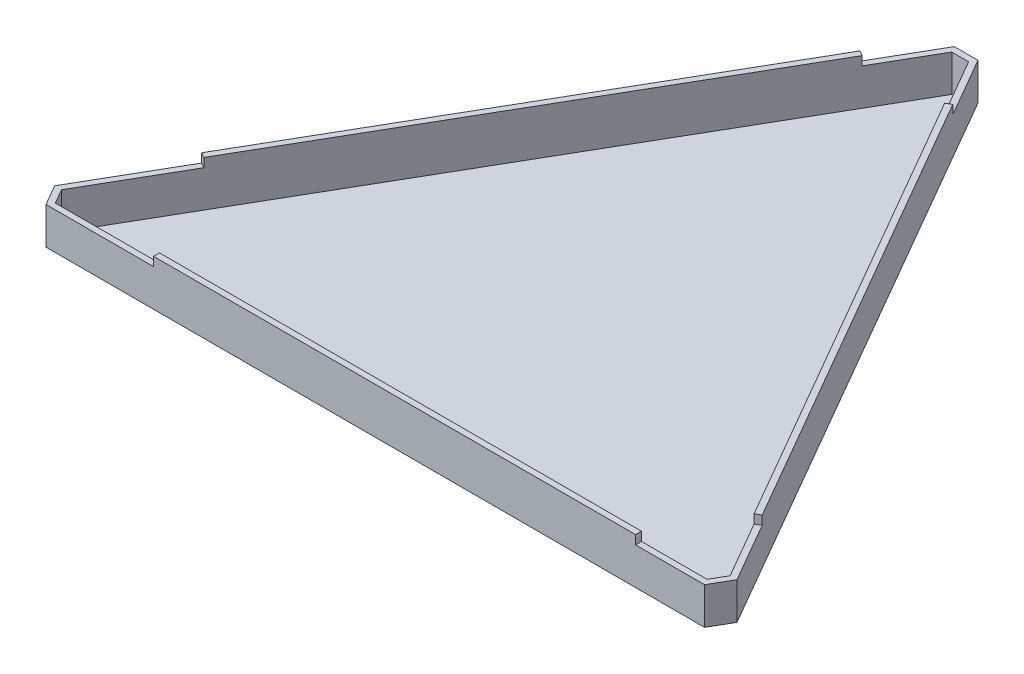
ISO-10303-21;
HEADER;
FILE_DESCRIPTION(('STEP AP214'),'2;1');
FILE_NAME('part.step','',(''),(''),'','','');
FILE_SCHEMA(('AUTOMOTIVE_DESIGN { 1 0 10303 214 1 1 1 1 }'));
ENDSEC;
DATA;
#1=APPLICATION_CONTEXT('core data for automotive mechanical design processes');
#2=APPLICATION_PROTOCOL_DEFINITION('international standard','automotive_design',2000,#1);
#3=PRODUCT_CONTEXT('',#1,'mechanical');
#4=PRODUCT('Part','Part','',(#3));
#5=PRODUCT_RELATED_PRODUCT_CATEGORY('part','',(#4));
#6=PRODUCT_DEFINITION_FORMATION('','',#4);
#7=PRODUCT_DEFINITION_CONTEXT('part definition',#1,'design');
#8=PRODUCT_DEFINITION('design','',#6,#7);
#9=PRODUCT_DEFINITION_SHAPE('','',#8);
#10=(LENGTH_UNIT() NAMED_UNIT(*) SI_UNIT(.MILLI.,.METRE.));
#11=(NAMED_UNIT(*) PLANE_ANGLE_UNIT() SI_UNIT($,.RADIAN.));
#12=(NAMED_UNIT(*) SI_UNIT($,.STERADIAN.) SOLID_ANGLE_UNIT());
#13=UNCERTAINTY_MEASURE_WITH_UNIT(LENGTH_MEASURE(1.E-05),#10,'distance_accuracy_value','');
#14=(GEOMETRIC_REPRESENTATION_CONTEXT(3) GLOBAL_UNCERTAINTY_ASSIGNED_CONTEXT((#13)) GLOBAL_UNIT_ASSIGNED_CONTEXT((#10,
#11,#12)) REPRESENTATION_CONTEXT('',''));
#15=CARTESIAN_POINT('',(0.,0.,0.));
#16=DIRECTION('',(0.,0.,1.));
#17=DIRECTION('',(1.,0.,0.));
#18=AXIS2_PLACEMENT_3D('',#15,#16,#17);
#19=CARTESIAN_POINT('',(0.,0.08,0.));
#20=DIRECTION('',(0.,1.,0.));
#21=DIRECTION('',(0.,0.,1.));
#22=AXIS2_PLACEMENT_3D('',#19,#20,#21);
#23=PLANE('',#22);
#24=DIRECTION('',(-0.500000000000004,0.,-0.866025403784437));
#25=VECTOR('',#24,1.);
#26=CARTESIAN_POINT('',(84.5179491924322,0.08,-48.7964607176064));
#27=LINE('',#26,#25);
#28=CARTESIAN_POINT('',(112.690598923244,0.08,0.));
#29=VERTEX_POINT('',#28);
#30=CARTESIAN_POINT('',(2.84529946162276,0.08,-190.257639640145));
#31=VERTEX_POINT('',#30);
#32=EDGE_CURVE('E59',#29,#31,#27,.T.);
#33=ORIENTED_EDGE('',*,*,#32,.T.);
#34=DIRECTION('',(-1.,0.,3.02401506656851E-13));
#35=VECTOR('',#34,1.);
#36=CARTESIAN_POINT('',(-5.7534196880156E-11,0.08,-190.257639640144));
#37=LINE('',#36,#35);
#38=CARTESIAN_POINT('',(-2.84529946162175,0.08,-190.257639640144));
#39=VERTEX_POINT('',#38);
#40=EDGE_CURVE('E303',#31,#39,#37,.T.);
#41=ORIENTED_EDGE('',*,*,#40,.T.);
#42=DIRECTION('',(-0.500000000000004,0.,0.866025403784436));
#43=VECTOR('',#42,1.);
#44=CARTESIAN_POINT('',(-84.5179491924306,0.08,-48.7964607176055));
#45=LINE('',#44,#43);
#46=CARTESIAN_POINT('',(-112.690598923241,0.08,0.));
#47=VERTEX_POINT('',#46);
#48=EDGE_CURVE('E52',#39,#47,#45,.T.);
#49=ORIENTED_EDGE('',*,*,#48,.T.);
#50=DIRECTION('',(-0.499999999999998,0.,-0.86602540378444));
#51=VECTOR('',#50,1.);
#52=CARTESIAN_POINT('',(-84.5179491924314,0.08,48.7964607176051));
#53=LINE('',#52,#51);
#54=CARTESIAN_POINT('',(-109.845299461621,0.0800000000000002,4.92820323027554));
#55=VERTEX_POINT('',#54);
#56=EDGE_CURVE('E334',#55,#47,#53,.T.);
#57=ORIENTED_EDGE('',*,*,#56,.F.);
#58=DIRECTION('',(1.,0.,0.));
#59=VECTOR('',#58,1.);
#60=CARTESIAN_POINT('',(0.,0.08,4.92820323027603));
#61=LINE('',#60,#59);
#62=CARTESIAN_POINT('',(109.845299461621,0.08,4.92820323027552));
#63=VERTEX_POINT('',#62);
#64=EDGE_CURVE('E362',#55,#63,#61,.T.);
#65=ORIENTED_EDGE('',*,*,#64,.T.);
#66=DIRECTION('',(0.500000000000268,0.,-0.866025403784284));
#67=VECTOR('',#66,1.);
#68=CARTESIAN_POINT('',(84.5179491924025,0.08,48.7964607176236));
#69=LINE('',#68,#67);
#70=EDGE_CURVE('E364',#63,#29,#69,.T.);
#71=ORIENTED_EDGE('',*,*,#70,.T.);
#72=EDGE_LOOP('',(#33,#41,#49,#57,#65,#71));
#73=FACE_BOUND('',#72,.T.);
#74=ADVANCED_FACE('F37',(#73),#23,.T.);
#75=CARTESIAN_POINT('',(86.25,0.08,-49.7964607176052));
#76=DIRECTION('',(-0.866025403784439,0.,0.5));
#77=DIRECTION('',(0.5,0.,0.866025403784439));
#78=AXIS2_PLACEMENT_3D('',#75,#76,#77);
#79=PLANE('',#78);
#80=DIRECTION('',(-0.5,0.,-0.866025403784439));
#81=VECTOR('',#80,1.);
#82=CARTESIAN_POINT('',(86.25,0.,-49.7964607176052));
#83=LINE('',#82,#81);
#84=CARTESIAN_POINT('',(115.,0.,0.));
#85=VERTEX_POINT('',#84);
#86=CARTESIAN_POINT('',(4.,0.,-192.257639640145));
#87=VERTEX_POINT('',#86);
#88=EDGE_CURVE('E367',#85,#87,#83,.T.);
#89=ORIENTED_EDGE('',*,*,#88,.T.);
#90=DIRECTION('',(0.,-1.,0.));
#91=VECTOR('',#90,1.);
#92=CARTESIAN_POINT('',(4.,0.08,-192.257639640145));
#93=LINE('',#92,#91);
#94=CARTESIAN_POINT('',(4.,12.46,-192.257639640145));
#95=VERTEX_POINT('',#94);
#96=EDGE_CURVE('E11',#95,#87,#93,.T.);
#97=ORIENTED_EDGE('',*,*,#96,.F.);
#98=DIRECTION('',(0.500000000000004,0.,0.866025403784436));
#99=VECTOR('',#98,1.);
#100=CARTESIAN_POINT('',(86.2500000000004,12.46,-49.7964607176059));
#101=LINE('',#100,#99);
#102=CARTESIAN_POINT('',(15.6250000000031,12.46,-172.122549002152));
#103=VERTEX_POINT('',#102);
#104=EDGE_CURVE('E276',#95,#103,#101,.T.);
#105=ORIENTED_EDGE('',*,*,#104,.T.);
#106=DIRECTION('',(0.,-1.,0.));
#107=VECTOR('',#106,1.);
#108=CARTESIAN_POINT('',(15.6250000000031,15.46,-172.122549002152));
#109=LINE('',#108,#107);
#110=CARTESIAN_POINT('',(15.6250000000031,15.46,-172.122549002152));
#111=VERTEX_POINT('',#110);
#112=EDGE_CURVE('E231',#111,#103,#109,.T.);
#113=ORIENTED_EDGE('',*,*,#112,.F.);
#114=DIRECTION('',(0.5,0.,0.866025403784439));
#115=VECTOR('',#114,1.);
#116=CARTESIAN_POINT('',(86.25,15.46,-49.7964607176052));
#117=LINE('',#116,#115);
#118=CARTESIAN_POINT('',(103.375000000003,15.46,-20.1350906379831));
#119=VERTEX_POINT('',#118);
#120=EDGE_CURVE('E224',#111,#119,#117,.T.);
#121=ORIENTED_EDGE('',*,*,#120,.T.);
#122=DIRECTION('',(0.,-1.,0.));
#123=VECTOR('',#122,1.);
#124=CARTESIAN_POINT('',(103.375000000003,15.46,-20.1350906379831));
#125=LINE('',#124,#123);
#126=CARTESIAN_POINT('',(103.375000000003,12.46,-20.1350906379831));
#127=VERTEX_POINT('',#126);
#128=EDGE_CURVE('E210',#119,#127,#125,.T.);
#129=ORIENTED_EDGE('',*,*,#128,.T.);
#130=DIRECTION('',(-0.5,0.,-0.866025403784439));
#131=VECTOR('',#130,1.);
#132=CARTESIAN_POINT('',(86.25,12.46,-49.7964607176052));
#133=LINE('',#132,#131);
#134=CARTESIAN_POINT('',(115.,12.46,0.));
#135=VERTEX_POINT('',#134);
#136=EDGE_CURVE('E354',#135,#127,#133,.T.);
#137=ORIENTED_EDGE('',*,*,#136,.F.);
#138=DIRECTION('',(0.,-1.,0.));
#139=VECTOR('',#138,1.);
#140=CARTESIAN_POINT('',(115.,0.08,0.));
#141=LINE('',#140,#139);
#142=EDGE_CURVE('E380',#135,#85,#141,.T.);
#143=ORIENTED_EDGE('',*,*,#142,.T.);
#144=EDGE_LOOP('',(#89,#97,#105,#113,#121,#129,#137,#143));
#145=FACE_BOUND('',#144,.T.);
#146=ADVANCED_FACE('F39',(#145),#79,.F.);
#147=CARTESIAN_POINT('',(0.,0.08,-192.257639640145));
#148=DIRECTION('',(0.,0.,1.));
#149=DIRECTION('',(1.,0.,0.));
#150=AXIS2_PLACEMENT_3D('',#147,#148,#149);
#151=PLANE('',#150);
#152=DIRECTION('',(-1.,0.,0.));
#153=VECTOR('',#152,1.);
#154=CARTESIAN_POINT('',(0.,0.,-192.257639640145));
#155=LINE('',#154,#153);
#156=CARTESIAN_POINT('',(-4.,0.,-192.257639640145));
#157=VERTEX_POINT('',#156);
#158=EDGE_CURVE('E369',#87,#157,#155,.T.);
#159=ORIENTED_EDGE('',*,*,#158,.T.);
#160=DIRECTION('',(0.,-1.,0.));
#161=VECTOR('',#160,1.);
#162=CARTESIAN_POINT('',(-4.,0.08,-192.257639640145));
#163=LINE('',#162,#161);
#164=CARTESIAN_POINT('',(-4.,12.46,-192.257639640145));
#165=VERTEX_POINT('',#164);
#166=EDGE_CURVE('E45',#165,#157,#163,.T.);
#167=ORIENTED_EDGE('',*,*,#166,.F.);
#168=DIRECTION('',(-1.,0.,0.));
#169=VECTOR('',#168,1.);
#170=CARTESIAN_POINT('',(0.,12.46,-192.257639640145));
#171=LINE('',#170,#169);
#172=EDGE_CURVE('E278',#95,#165,#171,.T.);
#173=ORIENTED_EDGE('',*,*,#172,.F.);
#174=ORIENTED_EDGE('',*,*,#96,.T.);
#175=EDGE_LOOP('',(#159,#167,#173,#174));
#176=FACE_BOUND('',#175,.T.);
#177=ADVANCED_FACE('F432',(#176),#151,.F.);
#178=CARTESIAN_POINT('',(-86.2499999999977,0.08,-49.7964607176066));
#179=DIRECTION('',(0.866025403784427,0.,0.50000000000002));
#180=DIRECTION('',(0.50000000000002,0.,-0.866025403784427));
#181=AXIS2_PLACEMENT_3D('',#178,#179,#180);
#182=PLANE('',#181);
#183=DIRECTION('',(-0.50000000000002,0.,0.866025403784427));
#184=VECTOR('',#183,1.);
#185=CARTESIAN_POINT('',(-86.2499999999977,0.,-49.7964607176066));
#186=LINE('',#185,#184);
#187=CARTESIAN_POINT('',(-115.,0.,0.));
#188=VERTEX_POINT('',#187);
#189=EDGE_CURVE('E371',#157,#188,#186,.T.);
#190=ORIENTED_EDGE('',*,*,#189,.T.);
#191=DIRECTION('',(0.,-1.,0.));
#192=VECTOR('',#191,1.);
#193=CARTESIAN_POINT('',(-115.,0.08,0.));
#194=LINE('',#193,#192);
#195=CARTESIAN_POINT('',(-115.,12.46,0.));
#196=VERTEX_POINT('',#195);
#197=EDGE_CURVE('E388',#196,#188,#194,.T.);
#198=ORIENTED_EDGE('',*,*,#197,.F.);
#199=DIRECTION('',(-0.50000000000002,0.,0.866025403784427));
#200=VECTOR('',#199,1.);
#201=CARTESIAN_POINT('',(-86.2499999999977,12.46,-49.7964607176066));
#202=LINE('',#201,#200);
#203=CARTESIAN_POINT('',(-96.8699999999991,12.46,-31.4020811412236));
#204=VERTEX_POINT('',#203);
#205=EDGE_CURVE('E307',#204,#196,#202,.T.);
#206=ORIENTED_EDGE('',*,*,#205,.F.);
#207=DIRECTION('',(0.,-1.,0.));
#208=VECTOR('',#207,1.);
#209=CARTESIAN_POINT('',(-96.8699999999991,15.46,-31.4020811412236));
#210=LINE('',#209,#208);
#211=CARTESIAN_POINT('',(-96.8699999999991,15.46,-31.4020811412236));
#212=VERTEX_POINT('',#211);
#213=EDGE_CURVE('E252',#212,#204,#210,.T.);
#214=ORIENTED_EDGE('',*,*,#213,.F.);
#215=DIRECTION('',(-0.499999999999995,0.,0.866025403784441));
#216=VECTOR('',#215,1.);
#217=CARTESIAN_POINT('',(-86.2499999999996,15.46,-49.7964607176044));
#218=LINE('',#217,#216);
#219=CARTESIAN_POINT('',(-15.6250000000001,15.46,-172.122549002157));
#220=VERTEX_POINT('',#219);
#221=EDGE_CURVE('E209',#220,#212,#218,.T.);
#222=ORIENTED_EDGE('',*,*,#221,.F.);
#223=DIRECTION('',(0.,-1.,0.));
#224=VECTOR('',#223,1.);
#225=CARTESIAN_POINT('',(-15.6250000000001,15.46,-172.122549002157));
#226=LINE('',#225,#224);
#227=CARTESIAN_POINT('',(-15.6250000000001,12.46,-172.122549002157));
#228=VERTEX_POINT('',#227);
#229=EDGE_CURVE('E244',#220,#228,#226,.T.);
#230=ORIENTED_EDGE('',*,*,#229,.T.);
#231=DIRECTION('',(0.500000000000003,0.,-0.866025403784437));
#232=VECTOR('',#231,1.);
#233=CARTESIAN_POINT('',(-86.2500000000003,12.46,-49.7964607176057));
#234=LINE('',#233,#232);
#235=EDGE_CURVE('E281',#228,#165,#234,.T.);
#236=ORIENTED_EDGE('',*,*,#235,.T.);
#237=ORIENTED_EDGE('',*,*,#166,.T.);
#238=EDGE_LOOP('',(#190,#198,#206,#214,#222,#230,#236,#237));
#239=FACE_BOUND('',#238,.T.);
#240=ADVANCED_FACE('F393',(#239),#182,.F.);
#241=CARTESIAN_POINT('',(-86.25,0.08,49.7964607176052));
#242=DIRECTION('',(0.866025403784439,0.,-0.5));
#243=DIRECTION('',(-0.5,0.,-0.866025403784439));
#244=AXIS2_PLACEMENT_3D('',#241,#242,#243);
#245=PLANE('',#244);
#246=DIRECTION('',(0.5,0.,0.866025403784439));
#247=VECTOR('',#246,1.);
#248=CARTESIAN_POINT('',(-86.25,0.,49.7964607176052));
#249=LINE('',#248,#247);
#250=CARTESIAN_POINT('',(-111.,0.,6.92820323027554));
#251=VERTEX_POINT('',#250);
#252=EDGE_CURVE('E373',#188,#251,#249,.T.);
#253=ORIENTED_EDGE('',*,*,#252,.T.);
#254=DIRECTION('',(0.,-1.,0.));
#255=VECTOR('',#254,1.);
#256=CARTESIAN_POINT('',(-111.,0.08,6.92820323027554));
#257=LINE('',#256,#255);
#258=CARTESIAN_POINT('',(-111.,12.46,6.92820323027554));
#259=VERTEX_POINT('',#258);
#260=EDGE_CURVE('E385',#259,#251,#257,.T.);
#261=ORIENTED_EDGE('',*,*,#260,.F.);
#262=DIRECTION('',(0.5,0.,0.866025403784439));
#263=VECTOR('',#262,1.);
#264=CARTESIAN_POINT('',(-86.25,12.46,49.7964607176052));
#265=LINE('',#264,#263);
#266=EDGE_CURVE('E310',#196,#259,#265,.T.);
#267=ORIENTED_EDGE('',*,*,#266,.F.);
#268=ORIENTED_EDGE('',*,*,#197,.T.);
#269=EDGE_LOOP('',(#253,#261,#267,#268));
#270=FACE_BOUND('',#269,.T.);
#271=ADVANCED_FACE('F404',(#270),#245,.F.);
#272=CARTESIAN_POINT('',(0.,0.08,6.92820323027546));
#273=DIRECTION('',(0.,0.,-1.));
#274=DIRECTION('',(-1.,0.,0.));
#275=AXIS2_PLACEMENT_3D('',#272,#273,#274);
#276=PLANE('',#275);
#277=DIRECTION('',(1.,0.,0.));
#278=VECTOR('',#277,1.);
#279=CARTESIAN_POINT('',(0.,12.46,6.92820323027546));
#280=LINE('',#279,#278);
#281=CARTESIAN_POINT('',(87.75,12.46,6.92820323027546));
#282=VERTEX_POINT('',#281);
#283=CARTESIAN_POINT('',(111.,12.46,6.92820323027546));
#284=VERTEX_POINT('',#283);
#285=EDGE_CURVE('E348',#282,#284,#280,.T.);
#286=ORIENTED_EDGE('',*,*,#285,.F.);
#287=DIRECTION('',(0.,-1.,0.));
#288=VECTOR('',#287,1.);
#289=CARTESIAN_POINT('',(87.75,15.46,6.92820323027546));
#290=LINE('',#289,#288);
#291=CARTESIAN_POINT('',(87.75,15.46,6.92820323027546));
#292=VERTEX_POINT('',#291);
#293=EDGE_CURVE('E271',#292,#282,#290,.T.);
#294=ORIENTED_EDGE('',*,*,#293,.F.);
#295=DIRECTION('',(-1.,0.,0.));
#296=VECTOR('',#295,1.);
#297=CARTESIAN_POINT('',(0.,15.46,6.92820323027639));
#298=LINE('',#297,#296);
#299=CARTESIAN_POINT('',(-74.739999999997,15.46,6.92820323027718));
#300=VERTEX_POINT('',#299);
#301=EDGE_CURVE('E257',#292,#300,#298,.T.);
#302=ORIENTED_EDGE('',*,*,#301,.T.);
#303=DIRECTION('',(0.,-1.,0.));
#304=VECTOR('',#303,1.);
#305=CARTESIAN_POINT('',(-74.739999999997,15.46,6.92820323027718));
#306=LINE('',#305,#304);
#307=CARTESIAN_POINT('',(-74.739999999997,12.46,6.92820323027718));
#308=VERTEX_POINT('',#307);
#309=EDGE_CURVE('E273',#300,#308,#306,.T.);
#310=ORIENTED_EDGE('',*,*,#309,.T.);
#311=DIRECTION('',(1.,0.,0.));
#312=VECTOR('',#311,1.);
#313=CARTESIAN_POINT('',(-3.1521261630446E-13,12.46,6.92820323028058));
#314=LINE('',#313,#312);
#315=EDGE_CURVE('E313',#259,#308,#314,.T.);
#316=ORIENTED_EDGE('',*,*,#315,.F.);
#317=ORIENTED_EDGE('',*,*,#260,.T.);
#318=DIRECTION('',(1.,0.,0.));
#319=VECTOR('',#318,1.);
#320=CARTESIAN_POINT('',(0.,0.,6.92820323027546));
#321=LINE('',#320,#319);
#322=CARTESIAN_POINT('',(111.,0.,6.92820323027546));
#323=VERTEX_POINT('',#322);
#324=EDGE_CURVE('E375',#251,#323,#321,.T.);
#325=ORIENTED_EDGE('',*,*,#324,.T.);
#326=DIRECTION('',(0.,-1.,0.));
#327=VECTOR('',#326,1.);
#328=CARTESIAN_POINT('',(111.,0.08,6.92820323027546));
#329=LINE('',#328,#327);
#330=EDGE_CURVE('E382',#284,#323,#329,.T.);
#331=ORIENTED_EDGE('',*,*,#330,.F.);
#332=EDGE_LOOP('',(#286,#294,#302,#310,#316,#317,#325,#331));
#333=FACE_BOUND('',#332,.T.);
#334=ADVANCED_FACE('F409',(#333),#276,.F.);
#335=CARTESIAN_POINT('',(86.25,0.08,49.7964607176052));
#336=DIRECTION('',(0.866025403784439,0.,0.5));
#337=DIRECTION('',(0.5,0.,-0.866025403784439));
#338=AXIS2_PLACEMENT_3D('',#335,#336,#337);
#339=PLANE('',#338);
#340=DIRECTION('',(-0.5,0.,0.866025403784439));
#341=VECTOR('',#340,1.);
#342=CARTESIAN_POINT('',(86.25,0.,49.7964607176052));
#343=LINE('',#342,#341);
#344=EDGE_CURVE('E377',#85,#323,#343,.T.);
#345=ORIENTED_EDGE('',*,*,#344,.F.);
#346=ORIENTED_EDGE('',*,*,#142,.F.);
#347=DIRECTION('',(-0.5,0.,0.866025403784439));
#348=VECTOR('',#347,1.);
#349=CARTESIAN_POINT('',(86.25,12.46,49.7964607176052));
#350=LINE('',#349,#348);
#351=EDGE_CURVE('E351',#135,#284,#350,.T.);
#352=ORIENTED_EDGE('',*,*,#351,.T.);
#353=ORIENTED_EDGE('',*,*,#330,.T.);
#354=EDGE_LOOP('',(#345,#346,#352,#353));
#355=FACE_BOUND('',#354,.T.);
#356=ADVANCED_FACE('F437',(#355),#339,.T.);
#357=CARTESIAN_POINT('',(0.,0.,0.));
#358=DIRECTION('',(0.,1.,0.));
#359=DIRECTION('',(0.,0.,1.));
#360=AXIS2_PLACEMENT_3D('',#357,#358,#359);
#361=PLANE('',#360);
#362=ORIENTED_EDGE('',*,*,#158,.F.);
#363=ORIENTED_EDGE('',*,*,#88,.F.);
#364=ORIENTED_EDGE('',*,*,#344,.T.);
#365=ORIENTED_EDGE('',*,*,#324,.F.);
#366=ORIENTED_EDGE('',*,*,#252,.F.);
#367=ORIENTED_EDGE('',*,*,#189,.F.);
#368=EDGE_LOOP('',(#362,#363,#364,#365,#366,#367));
#369=FACE_BOUND('',#368,.T.);
#370=ADVANCED_FACE('F400',(#369),#361,.F.);
#371=CARTESIAN_POINT('',(84.5179491924323,12.46,-48.7964607176064));
#372=DIRECTION('',(0.866025403784436,0.,-0.500000000000004));
#373=DIRECTION('',(-0.500000000000004,0.,-0.866025403784437));
#374=AXIS2_PLACEMENT_3D('',#371,#372,#373);
#375=PLANE('',#374);
#376=ORIENTED_EDGE('',*,*,#32,.F.);
#377=DIRECTION('',(0.,-1.,0.));
#378=VECTOR('',#377,1.);
#379=CARTESIAN_POINT('',(112.690598923244,12.46,0.));
#380=LINE('',#379,#378);
#381=CARTESIAN_POINT('',(112.690598923244,12.46,0.));
#382=VERTEX_POINT('',#381);
#383=EDGE_CURVE('E359',#382,#29,#380,.T.);
#384=ORIENTED_EDGE('',*,*,#383,.F.);
#385=DIRECTION('',(0.500000000000004,0.,0.866025403784437));
#386=VECTOR('',#385,1.);
#387=CARTESIAN_POINT('',(84.5179491924323,12.46,-48.7964607176064));
#388=LINE('',#387,#386);
#389=CARTESIAN_POINT('',(101.642949192436,12.46,-19.1350906379839));
#390=VERTEX_POINT('',#389);
#391=EDGE_CURVE('E204',#390,#382,#388,.T.);
#392=ORIENTED_EDGE('',*,*,#391,.F.);
#393=DIRECTION('',(0.,-1.,0.));
#394=VECTOR('',#393,1.);
#395=CARTESIAN_POINT('',(101.642949192436,15.46,-19.1350906379839));
#396=LINE('',#395,#394);
#397=CARTESIAN_POINT('',(101.642949192436,15.46,-19.1350906379839));
#398=VERTEX_POINT('',#397);
#399=EDGE_CURVE('E198',#398,#390,#396,.T.);
#400=ORIENTED_EDGE('',*,*,#399,.F.);
#401=DIRECTION('',(-0.500000000000004,0.,-0.866025403784437));
#402=VECTOR('',#401,1.);
#403=CARTESIAN_POINT('',(84.5179491924322,15.46,-48.7964607176064));
#404=LINE('',#403,#402);
#405=CARTESIAN_POINT('',(13.892949192435,15.46,-171.122549002152));
#406=VERTEX_POINT('',#405);
#407=EDGE_CURVE('E202',#398,#406,#404,.T.);
#408=ORIENTED_EDGE('',*,*,#407,.T.);
#409=DIRECTION('',(0.,-1.,0.));
#410=VECTOR('',#409,1.);
#411=CARTESIAN_POINT('',(13.892949192435,15.46,-171.122549002152));
#412=LINE('',#411,#410);
#413=CARTESIAN_POINT('',(13.892949192435,12.46,-171.122549002152));
#414=VERTEX_POINT('',#413);
#415=EDGE_CURVE('E229',#406,#414,#412,.T.);
#416=ORIENTED_EDGE('',*,*,#415,.T.);
#417=DIRECTION('',(0.49999999999997,0.,0.866025403784456));
#418=VECTOR('',#417,1.);
#419=CARTESIAN_POINT('',(84.5179491924294,12.46,-48.7964607176003));
#420=LINE('',#419,#418);
#421=CARTESIAN_POINT('',(2.84529946162275,12.46,-190.257639640145));
#422=VERTEX_POINT('',#421);
#423=EDGE_CURVE('E292',#422,#414,#420,.T.);
#424=ORIENTED_EDGE('',*,*,#423,.F.);
#425=DIRECTION('',(0.,-1.,0.));
#426=VECTOR('',#425,1.);
#427=CARTESIAN_POINT('',(2.84529946162275,12.46,-190.257639640145));
#428=LINE('',#427,#426);
#429=EDGE_CURVE('E297',#422,#31,#428,.T.);
#430=ORIENTED_EDGE('',*,*,#429,.T.);
#431=EDGE_LOOP('',(#376,#384,#392,#400,#408,#416,#424,#430));
#432=FACE_BOUND('',#431,.T.);
#433=ADVANCED_FACE('F200',(#432),#375,.F.);
#434=CARTESIAN_POINT('',(84.5179491924025,12.46,48.7964607176236));
#435=DIRECTION('',(0.866025403784284,0.,0.500000000000268));
#436=DIRECTION('',(0.500000000000268,0.,-0.866025403784284));
#437=AXIS2_PLACEMENT_3D('',#434,#435,#436);
#438=PLANE('',#437);
#439=ORIENTED_EDGE('',*,*,#70,.F.);
#440=DIRECTION('',(0.,-1.,0.));
#441=VECTOR('',#440,1.);
#442=CARTESIAN_POINT('',(109.845299461621,12.46,4.92820323027552));
#443=LINE('',#442,#441);
#444=CARTESIAN_POINT('',(109.845299461621,12.46,4.92820323027552));
#445=VERTEX_POINT('',#444);
#446=EDGE_CURVE('E356',#445,#63,#443,.T.);
#447=ORIENTED_EDGE('',*,*,#446,.F.);
#448=DIRECTION('',(-0.500000000000268,0.,0.866025403784284));
#449=VECTOR('',#448,1.);
#450=CARTESIAN_POINT('',(84.5179491924025,12.46,48.7964607176236));
#451=LINE('',#450,#449);
#452=EDGE_CURVE('E340',#382,#445,#451,.T.);
#453=ORIENTED_EDGE('',*,*,#452,.F.);
#454=ORIENTED_EDGE('',*,*,#383,.T.);
#455=EDGE_LOOP('',(#439,#447,#453,#454));
#456=FACE_BOUND('',#455,.T.);
#457=ADVANCED_FACE('F512',(#456),#438,.F.);
#458=CARTESIAN_POINT('',(0.,12.46,4.92820323027603));
#459=DIRECTION('',(0.,0.,1.));
#460=DIRECTION('',(1.,0.,0.));
#461=AXIS2_PLACEMENT_3D('',#458,#459,#460);
#462=PLANE('',#461);
#463=ORIENTED_EDGE('',*,*,#64,.F.);
#464=DIRECTION('',(0.,-1.,0.));
#465=VECTOR('',#464,1.);
#466=CARTESIAN_POINT('',(-109.845299461621,12.46,4.92820323027554));
#467=LINE('',#466,#465);
#468=CARTESIAN_POINT('',(-109.845299461621,12.46,4.92820323027554));
#469=VERTEX_POINT('',#468);
#470=EDGE_CURVE('E330',#469,#55,#467,.T.);
#471=ORIENTED_EDGE('',*,*,#470,.F.);
#472=DIRECTION('',(1.,0.,0.));
#473=VECTOR('',#472,1.);
#474=CARTESIAN_POINT('',(-1.24807318528596E-13,12.46,4.92820323027832));
#475=LINE('',#474,#473);
#476=CARTESIAN_POINT('',(-74.739999999997,12.46,4.92820323027643));
#477=VERTEX_POINT('',#476);
#478=EDGE_CURVE('E319',#469,#477,#475,.T.);
#479=ORIENTED_EDGE('',*,*,#478,.T.);
#480=DIRECTION('',(0.,-1.,0.));
#481=VECTOR('',#480,1.);
#482=CARTESIAN_POINT('',(-74.739999999997,15.46,4.92820323027643));
#483=LINE('',#482,#481);
#484=CARTESIAN_POINT('',(-74.739999999997,15.46,4.92820323027643));
#485=VERTEX_POINT('',#484);
#486=EDGE_CURVE('E266',#485,#477,#483,.T.);
#487=ORIENTED_EDGE('',*,*,#486,.F.);
#488=DIRECTION('',(1.,0.,0.));
#489=VECTOR('',#488,1.);
#490=CARTESIAN_POINT('',(0.,15.46,4.92820323027606));
#491=LINE('',#490,#489);
#492=CARTESIAN_POINT('',(87.75,15.46,4.92820323027563));
#493=VERTEX_POINT('',#492);
#494=EDGE_CURVE('E263',#485,#493,#491,.T.);
#495=ORIENTED_EDGE('',*,*,#494,.T.);
#496=DIRECTION('',(0.,-1.,0.));
#497=VECTOR('',#496,1.);
#498=CARTESIAN_POINT('',(87.75,15.46,4.92820323027563));
#499=LINE('',#498,#497);
#500=CARTESIAN_POINT('',(87.75,12.46,4.92820323027563));
#501=VERTEX_POINT('',#500);
#502=EDGE_CURVE('E268',#493,#501,#499,.T.);
#503=ORIENTED_EDGE('',*,*,#502,.T.);
#504=DIRECTION('',(-1.,0.,0.));
#505=VECTOR('',#504,1.);
#506=CARTESIAN_POINT('',(0.,12.46,4.92820323027603));
#507=LINE('',#506,#505);
#508=EDGE_CURVE('E342',#445,#501,#507,.T.);
#509=ORIENTED_EDGE('',*,*,#508,.F.);
#510=ORIENTED_EDGE('',*,*,#446,.T.);
#511=EDGE_LOOP('',(#463,#471,#479,#487,#495,#503,#509,#510));
#512=FACE_BOUND('',#511,.T.);
#513=ADVANCED_FACE('F446',(#512),#462,.F.);
#514=CARTESIAN_POINT('',(0.,12.46,0.));
#515=DIRECTION('',(0.,1.,0.));
#516=DIRECTION('',(0.,0.,1.));
#517=AXIS2_PLACEMENT_3D('',#514,#515,#516);
#518=PLANE('',#517);
#519=DIRECTION('',(-0.866025403784438,0.,0.500000000000001));
#520=VECTOR('',#519,1.);
#521=CARTESIAN_POINT('',(17.1250000000031,12.46,29.6613700796222));
#522=LINE('',#521,#520);
#523=EDGE_CURVE('E337',#127,#390,#522,.T.);
#524=ORIENTED_EDGE('',*,*,#523,.T.);
#525=ORIENTED_EDGE('',*,*,#391,.T.);
#526=ORIENTED_EDGE('',*,*,#452,.T.);
#527=ORIENTED_EDGE('',*,*,#508,.T.);
#528=DIRECTION('',(0.,0.,1.));
#529=VECTOR('',#528,1.);
#530=CARTESIAN_POINT('',(87.75,12.46,0.));
#531=LINE('',#530,#529);
#532=EDGE_CURVE('E345',#501,#282,#531,.T.);
#533=ORIENTED_EDGE('',*,*,#532,.T.);
#534=ORIENTED_EDGE('',*,*,#285,.T.);
#535=ORIENTED_EDGE('',*,*,#351,.F.);
#536=ORIENTED_EDGE('',*,*,#136,.T.);
#537=EDGE_LOOP('',(#524,#525,#526,#527,#533,#534,#535,#536));
#538=FACE_BOUND('',#537,.T.);
#539=ADVANCED_FACE('F440',(#538),#518,.T.);
#540=CARTESIAN_POINT('',(-84.5179491924314,12.46,48.7964607176051));
#541=DIRECTION('',(0.86602540378444,0.,-0.499999999999998));
#542=DIRECTION('',(-0.499999999999998,0.,-0.86602540378444));
#543=AXIS2_PLACEMENT_3D('',#540,#541,#542);
#544=PLANE('',#543);
#545=ORIENTED_EDGE('',*,*,#470,.T.);
#546=ORIENTED_EDGE('',*,*,#56,.T.);
#547=DIRECTION('',(0.,-1.,0.));
#548=VECTOR('',#547,1.);
#549=CARTESIAN_POINT('',(-112.690598923241,12.46,0.));
#550=LINE('',#549,#548);
#551=CARTESIAN_POINT('',(-112.690598923241,12.46,0.));
#552=VERTEX_POINT('',#551);
#553=EDGE_CURVE('E328',#552,#47,#550,.T.);
#554=ORIENTED_EDGE('',*,*,#553,.F.);
#555=DIRECTION('',(0.499999999999998,0.,0.86602540378444));
#556=VECTOR('',#555,1.);
#557=CARTESIAN_POINT('',(-84.5179491924314,12.46,48.7964607176051));
#558=LINE('',#557,#556);
#559=EDGE_CURVE('E322',#552,#469,#558,.T.);
#560=ORIENTED_EDGE('',*,*,#559,.T.);
#561=EDGE_LOOP('',(#545,#546,#554,#560));
#562=FACE_BOUND('',#561,.T.);
#563=ADVANCED_FACE('F530',(#562),#544,.T.);
#564=CARTESIAN_POINT('',(-84.5179491924306,12.46,-48.7964607176055));
#565=DIRECTION('',(-0.866025403784436,0.,-0.500000000000004));
#566=DIRECTION('',(-0.500000000000004,0.,0.866025403784436));
#567=AXIS2_PLACEMENT_3D('',#564,#565,#566);
#568=PLANE('',#567);
#569=ORIENTED_EDGE('',*,*,#48,.F.);
#570=DIRECTION('',(0.,-1.,0.));
#571=VECTOR('',#570,1.);
#572=CARTESIAN_POINT('',(-2.84529946162175,12.46,-190.257639640144));
#573=LINE('',#572,#571);
#574=CARTESIAN_POINT('',(-2.84529946162175,12.46,-190.257639640144));
#575=VERTEX_POINT('',#574);
#576=EDGE_CURVE('E300',#575,#39,#573,.T.);
#577=ORIENTED_EDGE('',*,*,#576,.F.);
#578=DIRECTION('',(-0.499999999999966,0.,0.866025403784458));
#579=VECTOR('',#578,1.);
#580=CARTESIAN_POINT('',(-84.5179491924274,12.46,-48.7964607175987));
#581=LINE('',#580,#579);
#582=CARTESIAN_POINT('',(-13.8929491924304,12.46,-171.122549002157));
#583=VERTEX_POINT('',#582);
#584=EDGE_CURVE('E287',#575,#583,#581,.T.);
#585=ORIENTED_EDGE('',*,*,#584,.T.);
#586=DIRECTION('',(0.,-1.,0.));
#587=VECTOR('',#586,1.);
#588=CARTESIAN_POINT('',(-13.8929491924304,15.46,-171.122549002157));
#589=LINE('',#588,#587);
#590=CARTESIAN_POINT('',(-13.8929491924304,15.46,-171.122549002157));
#591=VERTEX_POINT('',#590);
#592=EDGE_CURVE('E247',#591,#583,#589,.T.);
#593=ORIENTED_EDGE('',*,*,#592,.F.);
#594=DIRECTION('',(0.500000000000004,0.,-0.866025403784436));
#595=VECTOR('',#594,1.);
#596=CARTESIAN_POINT('',(-84.5179491924307,15.46,-48.7964607176055));
#597=LINE('',#596,#595);
#598=CARTESIAN_POINT('',(-95.1379491924308,15.46,-30.4020811412239));
#599=VERTEX_POINT('',#598);
#600=EDGE_CURVE('E239',#599,#591,#597,.T.);
#601=ORIENTED_EDGE('',*,*,#600,.F.);
#602=DIRECTION('',(0.,-1.,0.));
#603=VECTOR('',#602,1.);
#604=CARTESIAN_POINT('',(-95.1379491924308,15.46,-30.4020811412239));
#605=LINE('',#604,#603);
#606=CARTESIAN_POINT('',(-95.1379491924308,12.46,-30.4020811412239));
#607=VERTEX_POINT('',#606);
#608=EDGE_CURVE('E249',#599,#607,#605,.T.);
#609=ORIENTED_EDGE('',*,*,#608,.T.);
#610=DIRECTION('',(0.500000000000004,0.,-0.866025403784436));
#611=VECTOR('',#610,1.);
#612=CARTESIAN_POINT('',(-84.5179491924306,12.46,-48.7964607176055));
#613=LINE('',#612,#611);
#614=EDGE_CURVE('E325',#552,#607,#613,.T.);
#615=ORIENTED_EDGE('',*,*,#614,.F.);
#616=ORIENTED_EDGE('',*,*,#553,.T.);
#617=EDGE_LOOP('',(#569,#577,#585,#593,#601,#609,#615,#616));
#618=FACE_BOUND('',#617,.T.);
#619=ADVANCED_FACE('F537',(#618),#568,.F.);
#620=CARTESIAN_POINT('',(0.,12.46,0.));
#621=DIRECTION('',(0.,1.,0.));
#622=DIRECTION('',(0.,0.,1.));
#623=AXIS2_PLACEMENT_3D('',#620,#621,#622);
#624=PLANE('',#623);
#625=DIRECTION('',(0.866025403784427,0.,0.50000000000002));
#626=VECTOR('',#625,1.);
#627=CARTESIAN_POINT('',(-10.6200000000014,12.46,18.394379576383));
#628=LINE('',#627,#626);
#629=EDGE_CURVE('E305',#204,#607,#628,.T.);
#630=ORIENTED_EDGE('',*,*,#629,.F.);
#631=ORIENTED_EDGE('',*,*,#205,.T.);
#632=ORIENTED_EDGE('',*,*,#266,.T.);
#633=ORIENTED_EDGE('',*,*,#315,.T.);
#634=DIRECTION('',(0.,0.,-1.));
#635=VECTOR('',#634,1.);
#636=CARTESIAN_POINT('',(-74.739999999997,12.46,0.));
#637=LINE('',#636,#635);
#638=EDGE_CURVE('E316',#308,#477,#637,.T.);
#639=ORIENTED_EDGE('',*,*,#638,.T.);
#640=ORIENTED_EDGE('',*,*,#478,.F.);
#641=ORIENTED_EDGE('',*,*,#559,.F.);
#642=ORIENTED_EDGE('',*,*,#614,.T.);
#643=EDGE_LOOP('',(#630,#631,#632,#633,#639,#640,#641,#642));
#644=FACE_BOUND('',#643,.T.);
#645=ADVANCED_FACE('F412',(#644),#624,.T.);
#646=CARTESIAN_POINT('',(-5.7534196880156E-11,12.46,-190.257639640144));
#647=DIRECTION('',(-3.02401506656851E-13,0.,-1.));
#648=DIRECTION('',(-1.,0.,3.02401506656851E-13));
#649=AXIS2_PLACEMENT_3D('',#646,#647,#648);
#650=PLANE('',#649);
#651=ORIENTED_EDGE('',*,*,#40,.F.);
#652=ORIENTED_EDGE('',*,*,#429,.F.);
#653=DIRECTION('',(1.,0.,-3.02401506656851E-13));
#654=VECTOR('',#653,1.);
#655=CARTESIAN_POINT('',(-5.7534196880156E-11,12.46,-190.257639640144));
#656=LINE('',#655,#654);
#657=EDGE_CURVE('E290',#575,#422,#656,.T.);
#658=ORIENTED_EDGE('',*,*,#657,.F.);
#659=ORIENTED_EDGE('',*,*,#576,.T.);
#660=EDGE_LOOP('',(#651,#652,#658,#659));
#661=FACE_BOUND('',#660,.T.);
#662=ADVANCED_FACE('F461',(#661),#650,.F.);
#663=CARTESIAN_POINT('',(0.,12.46,0.));
#664=DIRECTION('',(0.,1.,0.));
#665=DIRECTION('',(0.,0.,1.));
#666=AXIS2_PLACEMENT_3D('',#663,#664,#665);
#667=PLANE('',#666);
#668=ORIENTED_EDGE('',*,*,#104,.F.);
#669=ORIENTED_EDGE('',*,*,#172,.T.);
#670=ORIENTED_EDGE('',*,*,#235,.F.);
#671=DIRECTION('',(0.866025403784422,0.,0.50000000000003));
#672=VECTOR('',#671,1.);
#673=CARTESIAN_POINT('',(70.6250000000024,12.46,-122.326088284547));
#674=LINE('',#673,#672);
#675=EDGE_CURVE('E284',#228,#583,#674,.T.);
#676=ORIENTED_EDGE('',*,*,#675,.T.);
#677=ORIENTED_EDGE('',*,*,#584,.F.);
#678=ORIENTED_EDGE('',*,*,#657,.T.);
#679=ORIENTED_EDGE('',*,*,#423,.T.);
#680=DIRECTION('',(-0.866025403784433,0.,0.500000000000009));
#681=VECTOR('',#680,1.);
#682=CARTESIAN_POINT('',(-70.6249999999978,12.46,-122.326088284545));
#683=LINE('',#682,#681);
#684=EDGE_CURVE('E294',#103,#414,#683,.T.);
#685=ORIENTED_EDGE('',*,*,#684,.F.);
#686=EDGE_LOOP('',(#668,#669,#670,#676,#677,#678,#679,#685));
#687=FACE_BOUND('',#686,.T.);
#688=ADVANCED_FACE('F429',(#687),#667,.T.);
#689=CARTESIAN_POINT('',(-74.739999999997,15.46,0.));
#690=DIRECTION('',(-1.,0.,0.));
#691=DIRECTION('',(0.,0.,1.));
#692=AXIS2_PLACEMENT_3D('',#689,#690,#691);
#693=PLANE('',#692);
#694=ORIENTED_EDGE('',*,*,#486,.T.);
#695=ORIENTED_EDGE('',*,*,#638,.F.);
#696=ORIENTED_EDGE('',*,*,#309,.F.);
#697=DIRECTION('',(0.,0.,-1.));
#698=VECTOR('',#697,1.);
#699=CARTESIAN_POINT('',(-74.739999999997,15.46,0.));
#700=LINE('',#699,#698);
#701=EDGE_CURVE('E254',#300,#485,#700,.T.);
#702=ORIENTED_EDGE('',*,*,#701,.T.);
#703=EDGE_LOOP('',(#694,#695,#696,#702));
#704=FACE_BOUND('',#703,.T.);
#705=ADVANCED_FACE('F453',(#704),#693,.T.);
#706=CARTESIAN_POINT('',(87.75,15.46,0.));
#707=DIRECTION('',(1.,0.,0.));
#708=DIRECTION('',(0.,0.,-1.));
#709=AXIS2_PLACEMENT_3D('',#706,#707,#708);
#710=PLANE('',#709);
#711=ORIENTED_EDGE('',*,*,#293,.T.);
#712=ORIENTED_EDGE('',*,*,#532,.F.);
#713=ORIENTED_EDGE('',*,*,#502,.F.);
#714=DIRECTION('',(0.,0.,1.));
#715=VECTOR('',#714,1.);
#716=CARTESIAN_POINT('',(87.75,15.46,0.));
#717=LINE('',#716,#715);
#718=EDGE_CURVE('E260',#493,#292,#717,.T.);
#719=ORIENTED_EDGE('',*,*,#718,.T.);
#720=EDGE_LOOP('',(#711,#712,#713,#719));
#721=FACE_BOUND('',#720,.T.);
#722=ADVANCED_FACE('F443',(#721),#710,.T.);
#723=CARTESIAN_POINT('',(0.,15.46,0.));
#724=DIRECTION('',(0.,1.,0.));
#725=DIRECTION('',(0.,0.,1.));
#726=AXIS2_PLACEMENT_3D('',#723,#724,#725);
#727=PLANE('',#726);
#728=ORIENTED_EDGE('',*,*,#701,.F.);
#729=ORIENTED_EDGE('',*,*,#301,.F.);
#730=ORIENTED_EDGE('',*,*,#718,.F.);
#731=ORIENTED_EDGE('',*,*,#494,.F.);
#732=EDGE_LOOP('',(#728,#729,#730,#731));
#733=FACE_BOUND('',#732,.T.);
#734=ADVANCED_FACE('F450',(#733),#727,.T.);
#735=CARTESIAN_POINT('',(-10.6200000000014,15.46,18.394379576383));
#736=DIRECTION('',(0.50000000000002,0.,-0.866025403784427));
#737=DIRECTION('',(-0.866025403784427,0.,-0.50000000000002));
#738=AXIS2_PLACEMENT_3D('',#735,#736,#737);
#739=PLANE('',#738);
#740=ORIENTED_EDGE('',*,*,#629,.T.);
#741=ORIENTED_EDGE('',*,*,#608,.F.);
#742=DIRECTION('',(0.866025403784427,0.,0.50000000000002));
#743=VECTOR('',#742,1.);
#744=CARTESIAN_POINT('',(-10.6200000000014,15.46,18.394379576383));
#745=LINE('',#744,#743);
#746=EDGE_CURVE('E237',#212,#599,#745,.T.);
#747=ORIENTED_EDGE('',*,*,#746,.F.);
#748=ORIENTED_EDGE('',*,*,#213,.T.);
#749=EDGE_LOOP('',(#740,#741,#747,#748));
#750=FACE_BOUND('',#749,.T.);
#751=ADVANCED_FACE('F419',(#750),#739,.F.);
#752=CARTESIAN_POINT('',(70.6250000000024,15.46,-122.326088284547));
#753=DIRECTION('',(0.500000000000029,0.,-0.866025403784422));
#754=DIRECTION('',(-0.866025403784422,0.,-0.50000000000003));
#755=AXIS2_PLACEMENT_3D('',#752,#753,#754);
#756=PLANE('',#755);
#757=ORIENTED_EDGE('',*,*,#592,.T.);
#758=ORIENTED_EDGE('',*,*,#675,.F.);
#759=ORIENTED_EDGE('',*,*,#229,.F.);
#760=DIRECTION('',(0.866025403784422,0.,0.50000000000003));
#761=VECTOR('',#760,1.);
#762=CARTESIAN_POINT('',(70.6250000000024,15.46,-122.326088284547));
#763=LINE('',#762,#761);
#764=EDGE_CURVE('E241',#220,#591,#763,.T.);
#765=ORIENTED_EDGE('',*,*,#764,.T.);
#766=EDGE_LOOP('',(#757,#758,#759,#765));
#767=FACE_BOUND('',#766,.T.);
#768=ADVANCED_FACE('F426',(#767),#756,.T.);
#769=CARTESIAN_POINT('',(0.,15.46,0.));
#770=DIRECTION('',(0.,1.,0.));
#771=DIRECTION('',(0.,0.,1.));
#772=AXIS2_PLACEMENT_3D('',#769,#770,#771);
#773=PLANE('',#772);
#774=ORIENTED_EDGE('',*,*,#221,.T.);
#775=ORIENTED_EDGE('',*,*,#746,.T.);
#776=ORIENTED_EDGE('',*,*,#600,.T.);
#777=ORIENTED_EDGE('',*,*,#764,.F.);
#778=EDGE_LOOP('',(#774,#775,#776,#777));
#779=FACE_BOUND('',#778,.T.);
#780=ADVANCED_FACE('F423',(#779),#773,.T.);
#781=CARTESIAN_POINT('',(17.1250000000031,15.46,29.6613700796222));
#782=DIRECTION('',(0.500000000000001,0.,0.866025403784438));
#783=DIRECTION('',(0.866025403784438,0.,-0.500000000000001));
#784=AXIS2_PLACEMENT_3D('',#781,#782,#783);
#785=PLANE('',#784);
#786=ORIENTED_EDGE('',*,*,#399,.T.);
#787=ORIENTED_EDGE('',*,*,#523,.F.);
#788=ORIENTED_EDGE('',*,*,#128,.F.);
#789=DIRECTION('',(-0.866025403784438,0.,0.500000000000001));
#790=VECTOR('',#789,1.);
#791=CARTESIAN_POINT('',(17.1250000000031,15.46,29.6613700796222));
#792=LINE('',#791,#790);
#793=EDGE_CURVE('E216',#119,#398,#792,.T.);
#794=ORIENTED_EDGE('',*,*,#793,.T.);
#795=EDGE_LOOP('',(#786,#787,#788,#794));
#796=FACE_BOUND('',#795,.T.);
#797=ADVANCED_FACE('F222',(#796),#785,.T.);
#798=CARTESIAN_POINT('',(-70.6249999999978,15.46,-122.326088284545));
#799=DIRECTION('',(0.500000000000009,0.,0.866025403784433));
#800=DIRECTION('',(0.866025403784433,0.,-0.500000000000009));
#801=AXIS2_PLACEMENT_3D('',#798,#799,#800);
#802=PLANE('',#801);
#803=ORIENTED_EDGE('',*,*,#684,.T.);
#804=ORIENTED_EDGE('',*,*,#415,.F.);
#805=DIRECTION('',(-0.866025403784433,0.,0.500000000000009));
#806=VECTOR('',#805,1.);
#807=CARTESIAN_POINT('',(-70.6249999999978,15.46,-122.326088284545));
#808=LINE('',#807,#806);
#809=EDGE_CURVE('E219',#111,#406,#808,.T.);
#810=ORIENTED_EDGE('',*,*,#809,.F.);
#811=ORIENTED_EDGE('',*,*,#112,.T.);
#812=EDGE_LOOP('',(#803,#804,#810,#811));
#813=FACE_BOUND('',#812,.T.);
#814=ADVANCED_FACE('F613',(#813),#802,.F.);
#815=CARTESIAN_POINT('',(0.,15.46,0.));
#816=DIRECTION('',(0.,1.,0.));
#817=DIRECTION('',(0.,0.,1.));
#818=AXIS2_PLACEMENT_3D('',#815,#816,#817);
#819=PLANE('',#818);
#820=ORIENTED_EDGE('',*,*,#407,.F.);
#821=ORIENTED_EDGE('',*,*,#793,.F.);
#822=ORIENTED_EDGE('',*,*,#120,.F.);
#823=ORIENTED_EDGE('',*,*,#809,.T.);
#824=EDGE_LOOP('',(#820,#821,#822,#823));
#825=FACE_BOUND('',#824,.T.);
#826=ADVANCED_FACE('F214',(#825),#819,.T.);
#827=CLOSED_SHELL('',(#74,#146,#177,#240,#271,#334,#356,#370,#433,#457,#513,#539,#563,#619,#645,
#662,#688,#705,#722,#734,#751,#768,#780,#797,#814,#826));
#828=MANIFOLD_SOLID_BREP('B2',#827);
#829=ADVANCED_BREP_SHAPE_REPRESENTATION('',(#18,#828),#14);
#830=SHAPE_DEFINITION_REPRESENTATION(#9,#829);
ENDSEC;
END-ISO-10303-21;
